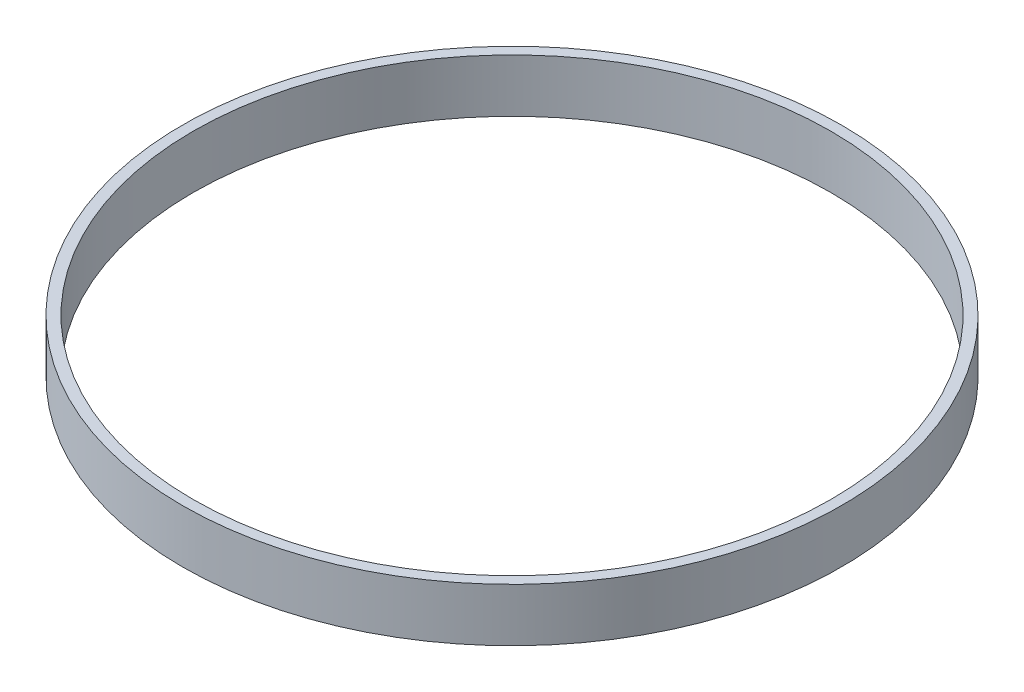
ISO-10303-21;
HEADER;
FILE_DESCRIPTION(('STEP AP214'),'2;1');
FILE_NAME('part.step','',(''),(''),'','','');
FILE_SCHEMA(('AUTOMOTIVE_DESIGN { 1 0 10303 214 1 1 1 1 }'));
ENDSEC;
DATA;
#1=APPLICATION_CONTEXT('core data for automotive mechanical design processes');
#2=APPLICATION_PROTOCOL_DEFINITION('international standard','automotive_design',2000,#1);
#3=PRODUCT_CONTEXT('',#1,'mechanical');
#4=PRODUCT('Part','Part','',(#3));
#5=PRODUCT_RELATED_PRODUCT_CATEGORY('part','',(#4));
#6=PRODUCT_DEFINITION_FORMATION('','',#4);
#7=PRODUCT_DEFINITION_CONTEXT('part definition',#1,'design');
#8=PRODUCT_DEFINITION('design','',#6,#7);
#9=PRODUCT_DEFINITION_SHAPE('','',#8);
#10=(LENGTH_UNIT() NAMED_UNIT(*) SI_UNIT(.MILLI.,.METRE.));
#11=(NAMED_UNIT(*) PLANE_ANGLE_UNIT() SI_UNIT($,.RADIAN.));
#12=(NAMED_UNIT(*) SI_UNIT($,.STERADIAN.) SOLID_ANGLE_UNIT());
#13=UNCERTAINTY_MEASURE_WITH_UNIT(LENGTH_MEASURE(1.E-05),#10,'distance_accuracy_value','');
#14=(GEOMETRIC_REPRESENTATION_CONTEXT(3) GLOBAL_UNCERTAINTY_ASSIGNED_CONTEXT((#13)) GLOBAL_UNIT_ASSIGNED_CONTEXT((#10,
#11,#12)) REPRESENTATION_CONTEXT('',''));
#15=CARTESIAN_POINT('',(0.,0.,0.));
#16=DIRECTION('',(0.,0.,1.));
#17=DIRECTION('',(1.,0.,0.));
#18=AXIS2_PLACEMENT_3D('',#15,#16,#17);
#19=CARTESIAN_POINT('',(0.,1.875,0.));
#20=DIRECTION('',(0.,1.,0.));
#21=DIRECTION('',(0.,0.,1.));
#22=AXIS2_PLACEMENT_3D('',#19,#20,#21);
#23=PLANE('',#22);
#24=CARTESIAN_POINT('',(0.,1.875,0.));
#25=DIRECTION('',(0.,1.,0.));
#26=DIRECTION('',(0.,0.,1.));
#27=AXIS2_PLACEMENT_3D('',#24,#25,#26);
#28=CIRCLE('',#27,7.75);
#29=CARTESIAN_POINT('',(0.,1.875,7.75000000000001));
#30=VERTEX_POINT('',#29);
#31=EDGE_CURVE('E10',#30,#30,#28,.T.);
#32=ORIENTED_EDGE('',*,*,#31,.T.);
#33=EDGE_LOOP('',(#32));
#34=FACE_BOUND('',#33,.T.);
#35=CARTESIAN_POINT('',(0.,1.875,0.));
#36=DIRECTION('',(0.,1.,0.));
#37=DIRECTION('',(0.,0.,1.));
#38=AXIS2_PLACEMENT_3D('',#35,#36,#37);
#39=CIRCLE('',#38,7.5);
#40=CARTESIAN_POINT('',(0.,1.875,7.50000000000001));
#41=VERTEX_POINT('',#40);
#42=EDGE_CURVE('E49',#41,#41,#39,.T.);
#43=ORIENTED_EDGE('',*,*,#42,.F.);
#44=EDGE_LOOP('',(#43));
#45=FACE_BOUND('',#44,.T.);
#46=ADVANCED_FACE('F36',(#34,#45),#23,.T.);
#47=CARTESIAN_POINT('',(0.,0.625000000000001,0.));
#48=DIRECTION('',(0.,1.,0.));
#49=DIRECTION('',(0.,0.,1.));
#50=AXIS2_PLACEMENT_3D('',#47,#48,#49);
#51=PLANE('',#50);
#52=CARTESIAN_POINT('',(0.,0.625000000000001,0.));
#53=DIRECTION('',(0.,1.,0.));
#54=DIRECTION('',(0.,0.,1.));
#55=AXIS2_PLACEMENT_3D('',#52,#53,#54);
#56=CIRCLE('',#55,7.75);
#57=CARTESIAN_POINT('',(0.,0.625000000000001,7.75000000000001));
#58=VERTEX_POINT('',#57);
#59=EDGE_CURVE('E40',#58,#58,#56,.T.);
#60=ORIENTED_EDGE('',*,*,#59,.F.);
#61=EDGE_LOOP('',(#60));
#62=FACE_BOUND('',#61,.T.);
#63=CARTESIAN_POINT('',(0.,0.625000000000001,0.));
#64=DIRECTION('',(0.,1.,0.));
#65=DIRECTION('',(0.,0.,1.));
#66=AXIS2_PLACEMENT_3D('',#63,#64,#65);
#67=CIRCLE('',#66,7.5);
#68=CARTESIAN_POINT('',(0.,0.625000000000001,7.50000000000001));
#69=VERTEX_POINT('',#68);
#70=EDGE_CURVE('E51',#69,#69,#67,.T.);
#71=ORIENTED_EDGE('',*,*,#70,.T.);
#72=EDGE_LOOP('',(#71));
#73=FACE_BOUND('',#72,.T.);
#74=ADVANCED_FACE('F63',(#62,#73),#51,.F.);
#75=CARTESIAN_POINT('',(0.,1.875,0.));
#76=DIRECTION('',(0.,-1.,0.));
#77=DIRECTION('',(0.,0.,-1.));
#78=AXIS2_PLACEMENT_3D('',#75,#76,#77);
#79=CYLINDRICAL_SURFACE('',#78,7.75);
#80=ORIENTED_EDGE('',*,*,#31,.F.);
#81=EDGE_LOOP('',(#80));
#82=FACE_BOUND('',#81,.T.);
#83=ORIENTED_EDGE('',*,*,#59,.T.);
#84=EDGE_LOOP('',(#83));
#85=FACE_BOUND('',#84,.T.);
#86=ADVANCED_FACE('F38',(#82,#85),#79,.T.);
#87=CARTESIAN_POINT('',(0.,1.875,0.));
#88=DIRECTION('',(0.,-1.,0.));
#89=DIRECTION('',(0.,0.,-1.));
#90=AXIS2_PLACEMENT_3D('',#87,#88,#89);
#91=CYLINDRICAL_SURFACE('',#90,7.5);
#92=ORIENTED_EDGE('',*,*,#42,.T.);
#93=EDGE_LOOP('',(#92));
#94=FACE_BOUND('',#93,.T.);
#95=ORIENTED_EDGE('',*,*,#70,.F.);
#96=EDGE_LOOP('',(#95));
#97=FACE_BOUND('',#96,.T.);
#98=ADVANCED_FACE('F59',(#94,#97),#91,.F.);
#99=CLOSED_SHELL('',(#46,#74,#86,#98));
#100=MANIFOLD_SOLID_BREP('B2',#99);
#101=ADVANCED_BREP_SHAPE_REPRESENTATION('',(#18,#100),#14);
#102=SHAPE_DEFINITION_REPRESENTATION(#9,#101);
ENDSEC;
END-ISO-10303-21;
